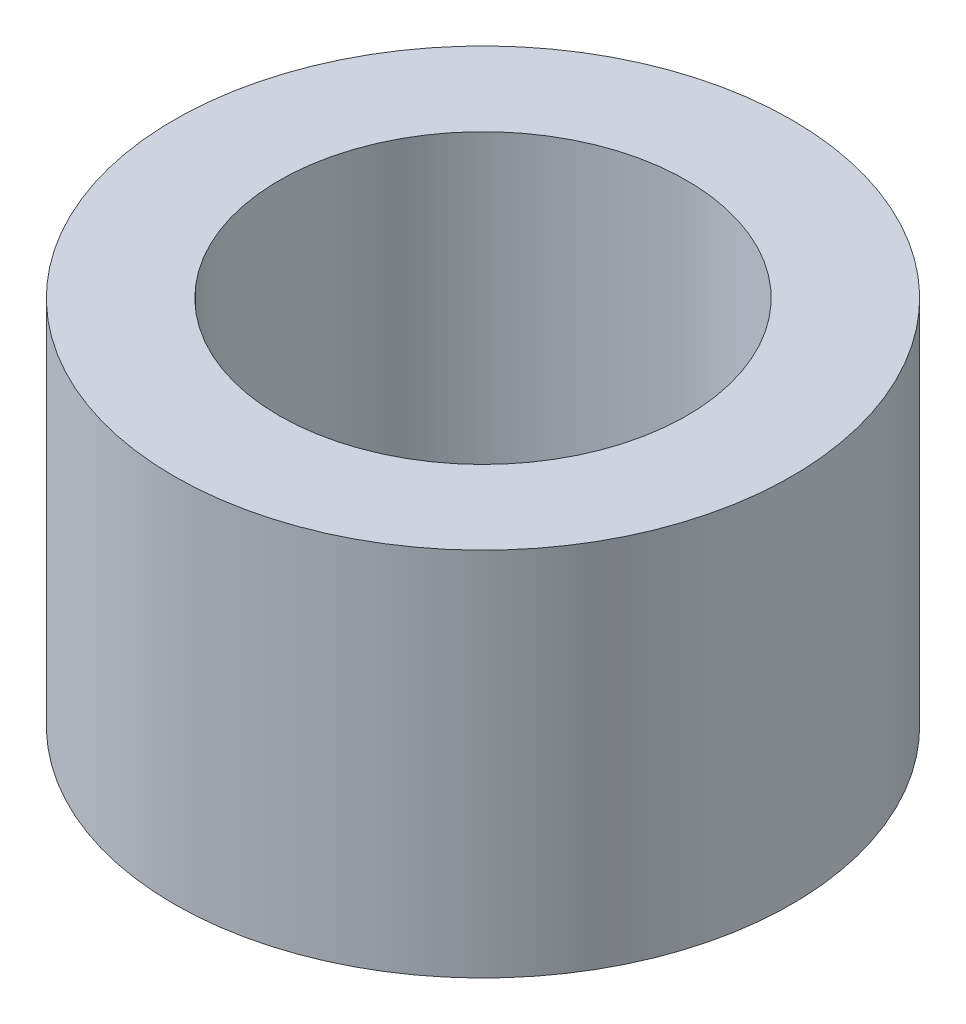
ISO-10303-21;
HEADER;
FILE_DESCRIPTION(('STEP AP214'),'2;1');
FILE_NAME('part.step','',(''),(''),'','','');
FILE_SCHEMA(('AUTOMOTIVE_DESIGN { 1 0 10303 214 1 1 1 1 }'));
ENDSEC;
DATA;
#1=APPLICATION_CONTEXT('core data for automotive mechanical design processes');
#2=APPLICATION_PROTOCOL_DEFINITION('international standard','automotive_design',2000,#1);
#3=PRODUCT_CONTEXT('',#1,'mechanical');
#4=PRODUCT('Part','Part','',(#3));
#5=PRODUCT_RELATED_PRODUCT_CATEGORY('part','',(#4));
#6=PRODUCT_DEFINITION_FORMATION('','',#4);
#7=PRODUCT_DEFINITION_CONTEXT('part definition',#1,'design');
#8=PRODUCT_DEFINITION('design','',#6,#7);
#9=PRODUCT_DEFINITION_SHAPE('','',#8);
#10=(LENGTH_UNIT() NAMED_UNIT(*) SI_UNIT(.MILLI.,.METRE.));
#11=(NAMED_UNIT(*) PLANE_ANGLE_UNIT() SI_UNIT($,.RADIAN.));
#12=(NAMED_UNIT(*) SI_UNIT($,.STERADIAN.) SOLID_ANGLE_UNIT());
#13=UNCERTAINTY_MEASURE_WITH_UNIT(LENGTH_MEASURE(1.E-05),#10,'distance_accuracy_value','');
#14=(GEOMETRIC_REPRESENTATION_CONTEXT(3) GLOBAL_UNCERTAINTY_ASSIGNED_CONTEXT((#13)) GLOBAL_UNIT_ASSIGNED_CONTEXT((#10,
#11,#12)) REPRESENTATION_CONTEXT('',''));
#15=CARTESIAN_POINT('',(0.,0.,0.));
#16=DIRECTION('',(0.,0.,1.));
#17=DIRECTION('',(1.,0.,0.));
#18=AXIS2_PLACEMENT_3D('',#15,#16,#17);
#19=CARTESIAN_POINT('',(0.,3.,0.));
#20=DIRECTION('',(0.,1.,0.));
#21=DIRECTION('',(0.,0.,1.));
#22=AXIS2_PLACEMENT_3D('',#19,#20,#21);
#23=PLANE('',#22);
#24=CARTESIAN_POINT('',(0.,3.,0.));
#25=DIRECTION('',(0.,1.,0.));
#26=DIRECTION('',(0.,0.,1.));
#27=AXIS2_PLACEMENT_3D('',#24,#25,#26);
#28=CIRCLE('',#27,2.5);
#29=CARTESIAN_POINT('',(0.,3.,2.5));
#30=VERTEX_POINT('',#29);
#31=EDGE_CURVE('E10',#30,#30,#28,.T.);
#32=ORIENTED_EDGE('',*,*,#31,.T.);
#33=EDGE_LOOP('',(#32));
#34=FACE_BOUND('',#33,.T.);
#35=CARTESIAN_POINT('',(0.,3.,0.));
#36=DIRECTION('',(0.,1.,0.));
#37=DIRECTION('',(0.,0.,1.));
#38=AXIS2_PLACEMENT_3D('',#35,#36,#37);
#39=CIRCLE('',#38,1.65);
#40=CARTESIAN_POINT('',(0.,3.,1.65));
#41=VERTEX_POINT('',#40);
#42=EDGE_CURVE('E48',#41,#41,#39,.T.);
#43=ORIENTED_EDGE('',*,*,#42,.F.);
#44=EDGE_LOOP('',(#43));
#45=FACE_BOUND('',#44,.T.);
#46=ADVANCED_FACE('F37',(#34,#45),#23,.T.);
#47=CARTESIAN_POINT('',(0.,0.,0.));
#48=DIRECTION('',(0.,1.,0.));
#49=DIRECTION('',(0.,0.,1.));
#50=AXIS2_PLACEMENT_3D('',#47,#48,#49);
#51=PLANE('',#50);
#52=CARTESIAN_POINT('',(0.,0.,0.));
#53=DIRECTION('',(0.,1.,0.));
#54=DIRECTION('',(0.,0.,1.));
#55=AXIS2_PLACEMENT_3D('',#52,#53,#54);
#56=CIRCLE('',#55,2.5);
#57=CARTESIAN_POINT('',(0.,0.,2.5));
#58=VERTEX_POINT('',#57);
#59=EDGE_CURVE('E41',#58,#58,#56,.T.);
#60=ORIENTED_EDGE('',*,*,#59,.F.);
#61=EDGE_LOOP('',(#60));
#62=FACE_BOUND('',#61,.T.);
#63=CARTESIAN_POINT('',(0.,0.,0.));
#64=DIRECTION('',(0.,1.,0.));
#65=DIRECTION('',(0.,0.,1.));
#66=AXIS2_PLACEMENT_3D('',#63,#64,#65);
#67=CIRCLE('',#66,1.65);
#68=CARTESIAN_POINT('',(0.,0.,1.65));
#69=VERTEX_POINT('',#68);
#70=EDGE_CURVE('E50',#69,#69,#67,.T.);
#71=ORIENTED_EDGE('',*,*,#70,.T.);
#72=EDGE_LOOP('',(#71));
#73=FACE_BOUND('',#72,.T.);
#74=ADVANCED_FACE('F60',(#62,#73),#51,.F.);
#75=CARTESIAN_POINT('',(0.,3.,0.));
#76=DIRECTION('',(0.,-1.,0.));
#77=DIRECTION('',(0.,0.,-1.));
#78=AXIS2_PLACEMENT_3D('',#75,#76,#77);
#79=CYLINDRICAL_SURFACE('',#78,2.5);
#80=ORIENTED_EDGE('',*,*,#31,.F.);
#81=EDGE_LOOP('',(#80));
#82=FACE_BOUND('',#81,.T.);
#83=ORIENTED_EDGE('',*,*,#59,.T.);
#84=EDGE_LOOP('',(#83));
#85=FACE_BOUND('',#84,.T.);
#86=ADVANCED_FACE('F39',(#82,#85),#79,.T.);
#87=CARTESIAN_POINT('',(0.,3.,0.));
#88=DIRECTION('',(0.,-1.,0.));
#89=DIRECTION('',(0.,0.,-1.));
#90=AXIS2_PLACEMENT_3D('',#87,#88,#89);
#91=CYLINDRICAL_SURFACE('',#90,1.65);
#92=ORIENTED_EDGE('',*,*,#42,.T.);
#93=EDGE_LOOP('',(#92));
#94=FACE_BOUND('',#93,.T.);
#95=ORIENTED_EDGE('',*,*,#70,.F.);
#96=EDGE_LOOP('',(#95));
#97=FACE_BOUND('',#96,.T.);
#98=ADVANCED_FACE('F56',(#94,#97),#91,.F.);
#99=CLOSED_SHELL('',(#46,#74,#86,#98));
#100=MANIFOLD_SOLID_BREP('B2',#99);
#101=ADVANCED_BREP_SHAPE_REPRESENTATION('',(#18,#100),#14);
#102=SHAPE_DEFINITION_REPRESENTATION(#9,#101);
ENDSEC;
END-ISO-10303-21;
